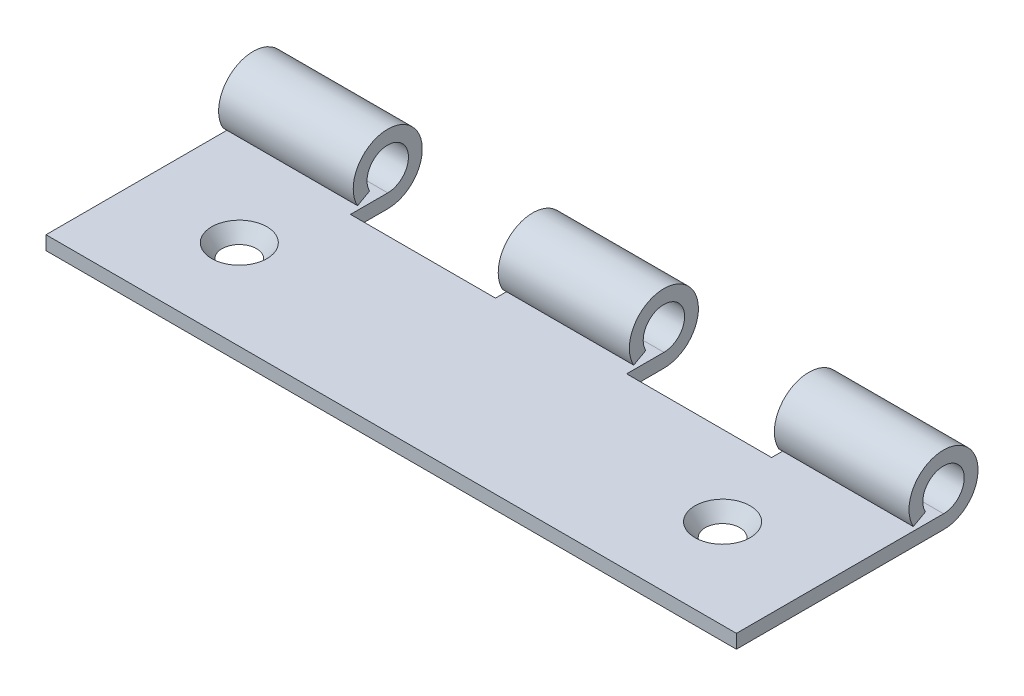
ISO-10303-21;
HEADER;
FILE_DESCRIPTION(('STEP AP214'),'2;1');
FILE_NAME('part.step','',(''),(''),'','','');
FILE_SCHEMA(('AUTOMOTIVE_DESIGN { 1 0 10303 214 1 1 1 1 }'));
ENDSEC;
DATA;
#1=APPLICATION_CONTEXT('core data for automotive mechanical design processes');
#2=APPLICATION_PROTOCOL_DEFINITION('international standard','automotive_design',2000,#1);
#3=PRODUCT_CONTEXT('',#1,'mechanical');
#4=PRODUCT('Part','Part','',(#3));
#5=PRODUCT_RELATED_PRODUCT_CATEGORY('part','',(#4));
#6=PRODUCT_DEFINITION_FORMATION('','',#4);
#7=PRODUCT_DEFINITION_CONTEXT('part definition',#1,'design');
#8=PRODUCT_DEFINITION('design','',#6,#7);
#9=PRODUCT_DEFINITION_SHAPE('','',#8);
#10=(LENGTH_UNIT() NAMED_UNIT(*) SI_UNIT(.MILLI.,.METRE.));
#11=(NAMED_UNIT(*) PLANE_ANGLE_UNIT() SI_UNIT($,.RADIAN.));
#12=(NAMED_UNIT(*) SI_UNIT($,.STERADIAN.) SOLID_ANGLE_UNIT());
#13=UNCERTAINTY_MEASURE_WITH_UNIT(LENGTH_MEASURE(1.E-05),#10,'distance_accuracy_value','');
#14=(GEOMETRIC_REPRESENTATION_CONTEXT(3) GLOBAL_UNCERTAINTY_ASSIGNED_CONTEXT((#13)) GLOBAL_UNIT_ASSIGNED_CONTEXT((#10,
#11,#12)) REPRESENTATION_CONTEXT('',''));
#15=CARTESIAN_POINT('',(0.,0.,0.));
#16=DIRECTION('',(0.,0.,1.));
#17=DIRECTION('',(1.,0.,0.));
#18=AXIS2_PLACEMENT_3D('',#15,#16,#17);
#19=CARTESIAN_POINT('',(0.,0.,0.));
#20=DIRECTION('',(1.,0.,0.));
#21=DIRECTION('',(0.,0.,-1.));
#22=AXIS2_PLACEMENT_3D('',#19,#20,#21);
#23=CYLINDRICAL_SURFACE('',#22,2.5);
#24=CARTESIAN_POINT('',(40.25,0.,0.));
#25=DIRECTION('',(1.,0.,0.));
#26=DIRECTION('',(0.,0.,-1.));
#27=AXIS2_PLACEMENT_3D('',#24,#25,#26);
#28=CIRCLE('',#27,2.5);
#29=CARTESIAN_POINT('',(40.25,-2.5,0.));
#30=VERTEX_POINT('',#29);
#31=CARTESIAN_POINT('',(40.25,-1.21202405061584,2.18654926784849));
#32=VERTEX_POINT('',#31);
#33=EDGE_CURVE('E193',#30,#32,#28,.T.);
#34=ORIENTED_EDGE('',*,*,#33,.T.);
#35=DIRECTION('',(1.,0.,0.));
#36=VECTOR('',#35,1.);
#37=CARTESIAN_POINT('',(0.,-1.21202405061584,2.18654926784849));
#38=LINE('',#37,#36);
#39=CARTESIAN_POINT('',(50.,-1.21202405061584,2.18654926784849));
#40=VERTEX_POINT('',#39);
#41=EDGE_CURVE('E287',#32,#40,#38,.T.);
#42=ORIENTED_EDGE('',*,*,#41,.T.);
#43=CARTESIAN_POINT('',(50.,0.,0.));
#44=DIRECTION('',(-1.,0.,0.));
#45=DIRECTION('',(0.,0.,1.));
#46=AXIS2_PLACEMENT_3D('',#43,#44,#45);
#47=CIRCLE('',#46,2.5);
#48=CARTESIAN_POINT('',(50.,-2.5,0.));
#49=VERTEX_POINT('',#48);
#50=EDGE_CURVE('E244',#40,#49,#47,.T.);
#51=ORIENTED_EDGE('',*,*,#50,.T.);
#52=DIRECTION('',(1.,0.,0.));
#53=VECTOR('',#52,1.);
#54=CARTESIAN_POINT('',(0.,-2.5,0.));
#55=LINE('',#54,#53);
#56=EDGE_CURVE('E314',#30,#49,#55,.T.);
#57=ORIENTED_EDGE('',*,*,#56,.F.);
#58=EDGE_LOOP('',(#34,#42,#51,#57));
#59=FACE_BOUND('',#58,.T.);
#60=ADVANCED_FACE('F15',(#59),#23,.T.);
#61=CARTESIAN_POINT('',(0.,0.,0.));
#62=DIRECTION('',(1.,0.,0.));
#63=DIRECTION('',(0.,0.,-1.));
#64=AXIS2_PLACEMENT_3D('',#61,#62,#63);
#65=CYLINDRICAL_SURFACE('',#64,1.5);
#66=CARTESIAN_POINT('',(40.25,0.,0.));
#67=DIRECTION('',(1.,0.,0.));
#68=DIRECTION('',(0.,0.,-1.));
#69=AXIS2_PLACEMENT_3D('',#66,#67,#68);
#70=CIRCLE('',#69,1.5);
#71=CARTESIAN_POINT('',(40.25,-1.5,0.));
#72=VERTEX_POINT('',#71);
#73=CARTESIAN_POINT('',(40.25,-0.727214430369506,1.31192956070909));
#74=VERTEX_POINT('',#73);
#75=EDGE_CURVE('E186',#72,#74,#70,.T.);
#76=ORIENTED_EDGE('',*,*,#75,.F.);
#77=DIRECTION('',(1.,0.,0.));
#78=VECTOR('',#77,1.);
#79=CARTESIAN_POINT('',(0.,-1.5,0.));
#80=LINE('',#79,#78);
#81=CARTESIAN_POINT('',(50.,-1.5,0.));
#82=VERTEX_POINT('',#81);
#83=EDGE_CURVE('E301',#72,#82,#80,.T.);
#84=ORIENTED_EDGE('',*,*,#83,.T.);
#85=CARTESIAN_POINT('',(50.,0.,0.));
#86=DIRECTION('',(-1.,0.,0.));
#87=DIRECTION('',(0.,0.,1.));
#88=AXIS2_PLACEMENT_3D('',#85,#86,#87);
#89=CIRCLE('',#88,1.5);
#90=CARTESIAN_POINT('',(50.,-0.727214430369506,1.31192956070909));
#91=VERTEX_POINT('',#90);
#92=EDGE_CURVE('E257',#91,#82,#89,.T.);
#93=ORIENTED_EDGE('',*,*,#92,.F.);
#94=DIRECTION('',(1.,0.,0.));
#95=VECTOR('',#94,1.);
#96=CARTESIAN_POINT('',(0.,-0.727214430369506,1.31192956070909));
#97=LINE('',#96,#95);
#98=EDGE_CURVE('E295',#74,#91,#97,.T.);
#99=ORIENTED_EDGE('',*,*,#98,.F.);
#100=EDGE_LOOP('',(#76,#84,#93,#99));
#101=FACE_BOUND('',#100,.T.);
#102=ADVANCED_FACE('F389',(#101),#65,.F.);
#103=CARTESIAN_POINT('',(0.,-0.727214430369506,1.31192956070909));
#104=DIRECTION('',(0.,0.874619707139396,0.484809620246337));
#105=DIRECTION('',(0.,0.484809620246337,-0.874619707139396));
#106=AXIS2_PLACEMENT_3D('',#103,#104,#105);
#107=PLANE('',#106);
#108=ORIENTED_EDGE('',*,*,#41,.F.);
#109=DIRECTION('',(0.,0.484809620246337,-0.874619707139396));
#110=VECTOR('',#109,1.);
#111=CARTESIAN_POINT('',(40.25,-0.727214430369503,1.31192956070909));
#112=LINE('',#111,#110);
#113=EDGE_CURVE('E189',#32,#74,#112,.T.);
#114=ORIENTED_EDGE('',*,*,#113,.T.);
#115=ORIENTED_EDGE('',*,*,#98,.T.);
#116=DIRECTION('',(0.,-0.484809620246337,0.874619707139396));
#117=VECTOR('',#116,1.);
#118=CARTESIAN_POINT('',(50.,-0.727214430369506,1.31192956070909));
#119=LINE('',#118,#117);
#120=EDGE_CURVE('E261',#91,#40,#119,.T.);
#121=ORIENTED_EDGE('',*,*,#120,.T.);
#122=EDGE_LOOP('',(#108,#114,#115,#121));
#123=FACE_BOUND('',#122,.T.);
#124=ADVANCED_FACE('F412',(#123),#107,.F.);
#125=CARTESIAN_POINT('',(20.25,-1.21202405061584,2.18654926784849));
#126=VERTEX_POINT('',#125);
#127=CARTESIAN_POINT('',(29.75,-1.21202405061584,2.18654926784849));
#128=VERTEX_POINT('',#127);
#129=EDGE_CURVE('E296',#126,#128,#38,.T.);
#130=ORIENTED_EDGE('',*,*,#129,.T.);
#131=CARTESIAN_POINT('',(29.75,0.,0.));
#132=DIRECTION('',(-1.,0.,0.));
#133=DIRECTION('',(0.,0.,1.));
#134=AXIS2_PLACEMENT_3D('',#131,#132,#133);
#135=CIRCLE('',#134,2.5);
#136=CARTESIAN_POINT('',(29.75,-2.5,0.));
#137=VERTEX_POINT('',#136);
#138=EDGE_CURVE('E183',#128,#137,#135,.T.);
#139=ORIENTED_EDGE('',*,*,#138,.T.);
#140=CARTESIAN_POINT('',(20.25,-2.5,0.));
#141=VERTEX_POINT('',#140);
#142=EDGE_CURVE('E164',#141,#137,#55,.T.);
#143=ORIENTED_EDGE('',*,*,#142,.F.);
#144=CARTESIAN_POINT('',(20.25,0.,0.));
#145=DIRECTION('',(1.,0.,0.));
#146=DIRECTION('',(0.,0.,-1.));
#147=AXIS2_PLACEMENT_3D('',#144,#145,#146);
#148=CIRCLE('',#147,2.5);
#149=EDGE_CURVE('E224',#141,#126,#148,.T.);
#150=ORIENTED_EDGE('',*,*,#149,.T.);
#151=EDGE_LOOP('',(#130,#139,#143,#150));
#152=FACE_BOUND('',#151,.T.);
#153=ADVANCED_FACE('F401',(#152),#23,.T.);
#154=CARTESIAN_POINT('',(29.75,0.,0.));
#155=DIRECTION('',(-1.,0.,0.));
#156=DIRECTION('',(0.,0.,1.));
#157=AXIS2_PLACEMENT_3D('',#154,#155,#156);
#158=CIRCLE('',#157,1.5);
#159=CARTESIAN_POINT('',(29.75,-0.727214430369505,1.31192956070909));
#160=VERTEX_POINT('',#159);
#161=CARTESIAN_POINT('',(29.75,-1.5,0.));
#162=VERTEX_POINT('',#161);
#163=EDGE_CURVE('E31',#160,#162,#158,.T.);
#164=ORIENTED_EDGE('',*,*,#163,.F.);
#165=CARTESIAN_POINT('',(20.25,-0.727214430369504,1.31192956070909));
#166=VERTEX_POINT('',#165);
#167=EDGE_CURVE('E302',#166,#160,#97,.T.);
#168=ORIENTED_EDGE('',*,*,#167,.F.);
#169=CARTESIAN_POINT('',(20.25,0.,0.));
#170=DIRECTION('',(1.,0.,0.));
#171=DIRECTION('',(0.,0.,-1.));
#172=AXIS2_PLACEMENT_3D('',#169,#170,#171);
#173=CIRCLE('',#172,1.5);
#174=CARTESIAN_POINT('',(20.25,-1.5,0.));
#175=VERTEX_POINT('',#174);
#176=EDGE_CURVE('E220',#175,#166,#173,.T.);
#177=ORIENTED_EDGE('',*,*,#176,.F.);
#178=EDGE_CURVE('E308',#175,#162,#80,.T.);
#179=ORIENTED_EDGE('',*,*,#178,.T.);
#180=EDGE_LOOP('',(#164,#168,#177,#179));
#181=FACE_BOUND('',#180,.T.);
#182=ADVANCED_FACE('F352',(#181),#65,.F.);
#183=ORIENTED_EDGE('',*,*,#167,.T.);
#184=DIRECTION('',(0.,-0.484809620246337,0.874619707139396));
#185=VECTOR('',#184,1.);
#186=CARTESIAN_POINT('',(29.75,-0.727214430369504,1.31192956070909));
#187=LINE('',#186,#185);
#188=EDGE_CURVE('E179',#160,#128,#187,.T.);
#189=ORIENTED_EDGE('',*,*,#188,.T.);
#190=ORIENTED_EDGE('',*,*,#129,.F.);
#191=DIRECTION('',(0.,0.484809620246337,-0.874619707139396));
#192=VECTOR('',#191,1.);
#193=CARTESIAN_POINT('',(20.25,-0.727214430369504,1.31192956070909));
#194=LINE('',#193,#192);
#195=EDGE_CURVE('E322',#126,#166,#194,.T.);
#196=ORIENTED_EDGE('',*,*,#195,.T.);
#197=EDGE_LOOP('',(#183,#189,#190,#196));
#198=FACE_BOUND('',#197,.T.);
#199=ADVANCED_FACE('F397',(#198),#107,.F.);
#200=CARTESIAN_POINT('',(0.,-2.5,0.));
#201=DIRECTION('',(0.,1.,0.));
#202=DIRECTION('',(-1.,0.,0.));
#203=AXIS2_PLACEMENT_3D('',#200,#201,#202);
#204=PLANE('',#203);
#205=CARTESIAN_POINT('',(42.5,-2.5,8.5));
#206=DIRECTION('',(0.,-1.,0.));
#207=DIRECTION('',(-1.,0.,0.));
#208=AXIS2_PLACEMENT_3D('',#205,#206,#207);
#209=CIRCLE('',#208,1.25);
#210=CARTESIAN_POINT('',(41.25,-2.5,8.5));
#211=VERTEX_POINT('',#210);
#212=EDGE_CURVE('E236',#211,#211,#209,.T.);
#213=ORIENTED_EDGE('',*,*,#212,.F.);
#214=EDGE_LOOP('',(#213));
#215=FACE_BOUND('',#214,.T.);
#216=DIRECTION('',(1.,0.,0.));
#217=VECTOR('',#216,1.);
#218=CARTESIAN_POINT('',(29.75,-2.5,2.7));
#219=LINE('',#218,#217);
#220=CARTESIAN_POINT('',(29.75,-2.5,2.7));
#221=VERTEX_POINT('',#220);
#222=CARTESIAN_POINT('',(40.25,-2.5,2.7));
#223=VERTEX_POINT('',#222);
#224=EDGE_CURVE('E149',#221,#223,#219,.T.);
#225=ORIENTED_EDGE('',*,*,#224,.T.);
#226=DIRECTION('',(0.,0.,1.));
#227=VECTOR('',#226,1.);
#228=CARTESIAN_POINT('',(40.25,-2.5,0.1));
#229=LINE('',#228,#227);
#230=EDGE_CURVE('E174',#30,#223,#229,.T.);
#231=ORIENTED_EDGE('',*,*,#230,.F.);
#232=ORIENTED_EDGE('',*,*,#56,.T.);
#233=DIRECTION('',(0.,0.,1.));
#234=VECTOR('',#233,1.);
#235=CARTESIAN_POINT('',(50.,-2.5,0.));
#236=LINE('',#235,#234);
#237=CARTESIAN_POINT('',(50.,-2.5,15.));
#238=VERTEX_POINT('',#237);
#239=EDGE_CURVE('E245',#49,#238,#236,.T.);
#240=ORIENTED_EDGE('',*,*,#239,.T.);
#241=DIRECTION('',(1.,0.,0.));
#242=VECTOR('',#241,1.);
#243=CARTESIAN_POINT('',(0.,-2.5,15.));
#244=LINE('',#243,#242);
#245=CARTESIAN_POINT('',(0.,-2.5,15.));
#246=VERTEX_POINT('',#245);
#247=EDGE_CURVE('E311',#246,#238,#244,.T.);
#248=ORIENTED_EDGE('',*,*,#247,.F.);
#249=DIRECTION('',(0.,0.,1.));
#250=VECTOR('',#249,1.);
#251=CARTESIAN_POINT('',(0.,-2.5,0.));
#252=LINE('',#251,#250);
#253=CARTESIAN_POINT('',(0.,-2.5,0.));
#254=VERTEX_POINT('',#253);
#255=EDGE_CURVE('E269',#254,#246,#252,.T.);
#256=ORIENTED_EDGE('',*,*,#255,.F.);
#257=CARTESIAN_POINT('',(9.75,-2.5,0.));
#258=VERTEX_POINT('',#257);
#259=EDGE_CURVE('E315',#254,#258,#55,.T.);
#260=ORIENTED_EDGE('',*,*,#259,.T.);
#261=DIRECTION('',(0.,0.,-1.));
#262=VECTOR('',#261,1.);
#263=CARTESIAN_POINT('',(9.75,-2.5,0.1));
#264=LINE('',#263,#262);
#265=CARTESIAN_POINT('',(9.75,-2.5,2.7));
#266=VERTEX_POINT('',#265);
#267=EDGE_CURVE('E196',#266,#258,#264,.T.);
#268=ORIENTED_EDGE('',*,*,#267,.F.);
#269=DIRECTION('',(1.,0.,0.));
#270=VECTOR('',#269,1.);
#271=CARTESIAN_POINT('',(9.75,-2.5,2.7));
#272=LINE('',#271,#270);
#273=CARTESIAN_POINT('',(20.25,-2.5,2.7));
#274=VERTEX_POINT('',#273);
#275=EDGE_CURVE('E202',#266,#274,#272,.T.);
#276=ORIENTED_EDGE('',*,*,#275,.T.);
#277=DIRECTION('',(0.,0.,1.));
#278=VECTOR('',#277,1.);
#279=CARTESIAN_POINT('',(20.25,-2.5,0.1));
#280=LINE('',#279,#278);
#281=EDGE_CURVE('E210',#141,#274,#280,.T.);
#282=ORIENTED_EDGE('',*,*,#281,.F.);
#283=ORIENTED_EDGE('',*,*,#142,.T.);
#284=DIRECTION('',(0.,0.,-1.));
#285=VECTOR('',#284,1.);
#286=CARTESIAN_POINT('',(29.75,-2.5,0.1));
#287=LINE('',#286,#285);
#288=EDGE_CURVE('E143',#221,#137,#287,.T.);
#289=ORIENTED_EDGE('',*,*,#288,.F.);
#290=EDGE_LOOP('',(#225,#231,#232,#240,#248,#256,#260,#268,#276,#282,#283,#289));
#291=FACE_BOUND('',#290,.T.);
#292=CARTESIAN_POINT('',(7.5,-2.5,8.5));
#293=DIRECTION('',(0.,-1.,0.));
#294=DIRECTION('',(-1.,0.,0.));
#295=AXIS2_PLACEMENT_3D('',#292,#293,#294);
#296=CIRCLE('',#295,1.25);
#297=CARTESIAN_POINT('',(6.25,-2.5,8.5));
#298=VERTEX_POINT('',#297);
#299=EDGE_CURVE('E227',#298,#298,#296,.T.);
#300=ORIENTED_EDGE('',*,*,#299,.F.);
#301=EDGE_LOOP('',(#300));
#302=FACE_BOUND('',#301,.T.);
#303=ADVANCED_FACE('F160',(#215,#291,#302),#204,.F.);
#304=CARTESIAN_POINT('',(0.,-1.5,0.));
#305=DIRECTION('',(0.,1.,0.));
#306=DIRECTION('',(-1.,0.,0.));
#307=AXIS2_PLACEMENT_3D('',#304,#305,#306);
#308=PLANE('',#307);
#309=DIRECTION('',(0.,0.,-1.));
#310=VECTOR('',#309,1.);
#311=CARTESIAN_POINT('',(40.25,-1.5,0.));
#312=LINE('',#311,#310);
#313=CARTESIAN_POINT('',(40.25,-1.5,2.7));
#314=VERTEX_POINT('',#313);
#315=EDGE_CURVE('E10',#314,#72,#312,.T.);
#316=ORIENTED_EDGE('',*,*,#315,.F.);
#317=DIRECTION('',(1.,0.,0.));
#318=VECTOR('',#317,1.);
#319=CARTESIAN_POINT('',(0.,-1.5,2.7));
#320=LINE('',#319,#318);
#321=CARTESIAN_POINT('',(29.75,-1.5,2.7));
#322=VERTEX_POINT('',#321);
#323=EDGE_CURVE('E24',#322,#314,#320,.T.);
#324=ORIENTED_EDGE('',*,*,#323,.F.);
#325=DIRECTION('',(0.,0.,1.));
#326=VECTOR('',#325,1.);
#327=CARTESIAN_POINT('',(29.75,-1.5,0.));
#328=LINE('',#327,#326);
#329=EDGE_CURVE('E145',#162,#322,#328,.T.);
#330=ORIENTED_EDGE('',*,*,#329,.F.);
#331=ORIENTED_EDGE('',*,*,#178,.F.);
#332=DIRECTION('',(0.,0.,-1.));
#333=VECTOR('',#332,1.);
#334=CARTESIAN_POINT('',(20.25,-1.5,0.));
#335=LINE('',#334,#333);
#336=CARTESIAN_POINT('',(20.25,-1.5,2.7));
#337=VERTEX_POINT('',#336);
#338=EDGE_CURVE('E223',#337,#175,#335,.T.);
#339=ORIENTED_EDGE('',*,*,#338,.F.);
#340=DIRECTION('',(1.,0.,0.));
#341=VECTOR('',#340,1.);
#342=CARTESIAN_POINT('',(0.,-1.5,2.7));
#343=LINE('',#342,#341);
#344=CARTESIAN_POINT('',(9.75,-1.5,2.7));
#345=VERTEX_POINT('',#344);
#346=EDGE_CURVE('E326',#345,#337,#343,.T.);
#347=ORIENTED_EDGE('',*,*,#346,.F.);
#348=DIRECTION('',(0.,0.,1.));
#349=VECTOR('',#348,1.);
#350=CARTESIAN_POINT('',(9.75,-1.5,0.));
#351=LINE('',#350,#349);
#352=CARTESIAN_POINT('',(9.75,-1.5,0.));
#353=VERTEX_POINT('',#352);
#354=EDGE_CURVE('E217',#353,#345,#351,.T.);
#355=ORIENTED_EDGE('',*,*,#354,.F.);
#356=CARTESIAN_POINT('',(0.,-1.5,0.));
#357=VERTEX_POINT('',#356);
#358=EDGE_CURVE('E303',#357,#353,#80,.T.);
#359=ORIENTED_EDGE('',*,*,#358,.F.);
#360=DIRECTION('',(0.,0.,1.));
#361=VECTOR('',#360,1.);
#362=CARTESIAN_POINT('',(0.,-1.5,0.));
#363=LINE('',#362,#361);
#364=CARTESIAN_POINT('',(0.,-1.5,15.));
#365=VERTEX_POINT('',#364);
#366=EDGE_CURVE('E276',#357,#365,#363,.T.);
#367=ORIENTED_EDGE('',*,*,#366,.T.);
#368=DIRECTION('',(1.,0.,0.));
#369=VECTOR('',#368,1.);
#370=CARTESIAN_POINT('',(0.,-1.5,15.));
#371=LINE('',#370,#369);
#372=CARTESIAN_POINT('',(50.,-1.5,15.));
#373=VERTEX_POINT('',#372);
#374=EDGE_CURVE('E307',#365,#373,#371,.T.);
#375=ORIENTED_EDGE('',*,*,#374,.T.);
#376=DIRECTION('',(0.,0.,1.));
#377=VECTOR('',#376,1.);
#378=CARTESIAN_POINT('',(50.,-1.5,0.));
#379=LINE('',#378,#377);
#380=EDGE_CURVE('E253',#82,#373,#379,.T.);
#381=ORIENTED_EDGE('',*,*,#380,.F.);
#382=ORIENTED_EDGE('',*,*,#83,.F.);
#383=EDGE_LOOP('',(#316,#324,#330,#331,#339,#347,#355,#359,#367,#375,#381,#382));
#384=FACE_BOUND('',#383,.T.);
#385=CARTESIAN_POINT('',(42.5,-1.5,8.5));
#386=DIRECTION('',(0.,-1.,0.));
#387=DIRECTION('',(-1.,0.,0.));
#388=AXIS2_PLACEMENT_3D('',#385,#386,#387);
#389=CIRCLE('',#388,2.);
#390=CARTESIAN_POINT('',(40.5,-1.5,8.5));
#391=VERTEX_POINT('',#390);
#392=EDGE_CURVE('E240',#391,#391,#389,.T.);
#393=ORIENTED_EDGE('',*,*,#392,.T.);
#394=EDGE_LOOP('',(#393));
#395=FACE_BOUND('',#394,.T.);
#396=CARTESIAN_POINT('',(7.5,-1.5,8.5));
#397=DIRECTION('',(0.,-1.,0.));
#398=DIRECTION('',(-1.,0.,0.));
#399=AXIS2_PLACEMENT_3D('',#396,#397,#398);
#400=CIRCLE('',#399,2.);
#401=CARTESIAN_POINT('',(5.5,-1.5,8.5));
#402=VERTEX_POINT('',#401);
#403=EDGE_CURVE('E232',#402,#402,#400,.T.);
#404=ORIENTED_EDGE('',*,*,#403,.T.);
#405=EDGE_LOOP('',(#404));
#406=FACE_BOUND('',#405,.T.);
#407=ADVANCED_FACE('F338',(#384,#395,#406),#308,.T.);
#408=CARTESIAN_POINT('',(0.,-1.21202405061584,2.18654926784849));
#409=VERTEX_POINT('',#408);
#410=CARTESIAN_POINT('',(9.75,-1.21202405061584,2.18654926784849));
#411=VERTEX_POINT('',#410);
#412=EDGE_CURVE('E291',#409,#411,#38,.T.);
#413=ORIENTED_EDGE('',*,*,#412,.T.);
#414=CARTESIAN_POINT('',(9.75,0.,0.));
#415=DIRECTION('',(-1.,0.,0.));
#416=DIRECTION('',(0.,0.,1.));
#417=AXIS2_PLACEMENT_3D('',#414,#415,#416);
#418=CIRCLE('',#417,2.5);
#419=EDGE_CURVE('E39',#411,#258,#418,.T.);
#420=ORIENTED_EDGE('',*,*,#419,.T.);
#421=ORIENTED_EDGE('',*,*,#259,.F.);
#422=CARTESIAN_POINT('',(0.,0.,0.));
#423=DIRECTION('',(-1.,0.,0.));
#424=DIRECTION('',(0.,0.,1.));
#425=AXIS2_PLACEMENT_3D('',#422,#423,#424);
#426=CIRCLE('',#425,2.5);
#427=EDGE_CURVE('E265',#409,#254,#426,.T.);
#428=ORIENTED_EDGE('',*,*,#427,.F.);
#429=EDGE_LOOP('',(#413,#420,#421,#428));
#430=FACE_BOUND('',#429,.T.);
#431=ADVANCED_FACE('F17',(#430),#23,.T.);
#432=CARTESIAN_POINT('',(0.,-1.5,15.));
#433=DIRECTION('',(0.,0.,1.));
#434=DIRECTION('',(1.,0.,0.));
#435=AXIS2_PLACEMENT_3D('',#432,#433,#434);
#436=PLANE('',#435);
#437=DIRECTION('',(0.,-1.,0.));
#438=VECTOR('',#437,1.);
#439=CARTESIAN_POINT('',(50.,-1.5,15.));
#440=LINE('',#439,#438);
#441=EDGE_CURVE('E249',#373,#238,#440,.T.);
#442=ORIENTED_EDGE('',*,*,#441,.F.);
#443=ORIENTED_EDGE('',*,*,#374,.F.);
#444=DIRECTION('',(0.,-1.,0.));
#445=VECTOR('',#444,1.);
#446=CARTESIAN_POINT('',(0.,-1.5,15.));
#447=LINE('',#446,#445);
#448=EDGE_CURVE('E272',#365,#246,#447,.T.);
#449=ORIENTED_EDGE('',*,*,#448,.T.);
#450=ORIENTED_EDGE('',*,*,#247,.T.);
#451=EDGE_LOOP('',(#442,#443,#449,#450));
#452=FACE_BOUND('',#451,.T.);
#453=ADVANCED_FACE('F381',(#452),#436,.T.);
#454=CARTESIAN_POINT('',(9.75,0.,0.));
#455=DIRECTION('',(-1.,0.,0.));
#456=DIRECTION('',(0.,0.,1.));
#457=AXIS2_PLACEMENT_3D('',#454,#455,#456);
#458=CIRCLE('',#457,1.5);
#459=CARTESIAN_POINT('',(9.75,-0.727214430369505,1.31192956070909));
#460=VERTEX_POINT('',#459);
#461=EDGE_CURVE('E212',#460,#353,#458,.T.);
#462=ORIENTED_EDGE('',*,*,#461,.F.);
#463=CARTESIAN_POINT('',(0.,-0.727214430369506,1.31192956070909));
#464=VERTEX_POINT('',#463);
#465=EDGE_CURVE('E297',#464,#460,#97,.T.);
#466=ORIENTED_EDGE('',*,*,#465,.F.);
#467=CARTESIAN_POINT('',(0.,0.,0.));
#468=DIRECTION('',(-1.,0.,0.));
#469=DIRECTION('',(0.,0.,1.));
#470=AXIS2_PLACEMENT_3D('',#467,#468,#469);
#471=CIRCLE('',#470,1.5);
#472=EDGE_CURVE('E280',#464,#357,#471,.T.);
#473=ORIENTED_EDGE('',*,*,#472,.T.);
#474=ORIENTED_EDGE('',*,*,#358,.T.);
#475=EDGE_LOOP('',(#462,#466,#473,#474));
#476=FACE_BOUND('',#475,.T.);
#477=ADVANCED_FACE('F372',(#476),#65,.F.);
#478=ORIENTED_EDGE('',*,*,#465,.T.);
#479=DIRECTION('',(0.,-0.484809620246337,0.874619707139396));
#480=VECTOR('',#479,1.);
#481=CARTESIAN_POINT('',(9.75,-0.727214430369505,1.31192956070909));
#482=LINE('',#481,#480);
#483=EDGE_CURVE('E319',#460,#411,#482,.T.);
#484=ORIENTED_EDGE('',*,*,#483,.T.);
#485=ORIENTED_EDGE('',*,*,#412,.F.);
#486=DIRECTION('',(0.,-0.484809620246337,0.874619707139396));
#487=VECTOR('',#486,1.);
#488=CARTESIAN_POINT('',(0.,-0.727214430369506,1.31192956070909));
#489=LINE('',#488,#487);
#490=EDGE_CURVE('E284',#464,#409,#489,.T.);
#491=ORIENTED_EDGE('',*,*,#490,.F.);
#492=EDGE_LOOP('',(#478,#484,#485,#491));
#493=FACE_BOUND('',#492,.T.);
#494=ADVANCED_FACE('F415',(#493),#107,.F.);
#495=CARTESIAN_POINT('',(0.,0.,0.));
#496=DIRECTION('',(-1.,0.,0.));
#497=DIRECTION('',(0.,0.,1.));
#498=AXIS2_PLACEMENT_3D('',#495,#496,#497);
#499=PLANE('',#498);
#500=ORIENTED_EDGE('',*,*,#427,.T.);
#501=ORIENTED_EDGE('',*,*,#255,.T.);
#502=ORIENTED_EDGE('',*,*,#448,.F.);
#503=ORIENTED_EDGE('',*,*,#366,.F.);
#504=ORIENTED_EDGE('',*,*,#472,.F.);
#505=ORIENTED_EDGE('',*,*,#490,.T.);
#506=EDGE_LOOP('',(#500,#501,#502,#503,#504,#505));
#507=FACE_BOUND('',#506,.T.);
#508=ADVANCED_FACE('F376',(#507),#499,.T.);
#509=CARTESIAN_POINT('',(50.,0.,0.));
#510=DIRECTION('',(-1.,0.,0.));
#511=DIRECTION('',(0.,0.,1.));
#512=AXIS2_PLACEMENT_3D('',#509,#510,#511);
#513=PLANE('',#512);
#514=ORIENTED_EDGE('',*,*,#50,.F.);
#515=ORIENTED_EDGE('',*,*,#120,.F.);
#516=ORIENTED_EDGE('',*,*,#92,.T.);
#517=ORIENTED_EDGE('',*,*,#380,.T.);
#518=ORIENTED_EDGE('',*,*,#441,.T.);
#519=ORIENTED_EDGE('',*,*,#239,.F.);
#520=EDGE_LOOP('',(#514,#515,#516,#517,#518,#519));
#521=FACE_BOUND('',#520,.T.);
#522=ADVANCED_FACE('F386',(#521),#513,.F.);
#523=CARTESIAN_POINT('',(42.5,-1.5,8.5));
#524=DIRECTION('',(0.,1.,0.));
#525=DIRECTION('',(1.,0.,0.));
#526=AXIS2_PLACEMENT_3D('',#523,#524,#525);
#527=CONICAL_SURFACE('',#526,2.,0.643501108793284);
#528=ORIENTED_EDGE('',*,*,#212,.T.);
#529=EDGE_LOOP('',(#528));
#530=FACE_BOUND('',#529,.T.);
#531=ORIENTED_EDGE('',*,*,#392,.F.);
#532=EDGE_LOOP('',(#531));
#533=FACE_BOUND('',#532,.T.);
#534=ADVANCED_FACE('F505',(#530,#533),#527,.F.);
#535=CARTESIAN_POINT('',(7.5,-1.5,8.5));
#536=DIRECTION('',(0.,1.,0.));
#537=DIRECTION('',(1.,0.,0.));
#538=AXIS2_PLACEMENT_3D('',#535,#536,#537);
#539=CONICAL_SURFACE('',#538,2.,0.643501108793284);
#540=ORIENTED_EDGE('',*,*,#299,.T.);
#541=EDGE_LOOP('',(#540));
#542=FACE_BOUND('',#541,.T.);
#543=ORIENTED_EDGE('',*,*,#403,.F.);
#544=EDGE_LOOP('',(#543));
#545=FACE_BOUND('',#544,.T.);
#546=ADVANCED_FACE('F514',(#542,#545),#539,.F.);
#547=CARTESIAN_POINT('',(20.25,0.,0.1));
#548=DIRECTION('',(1.,0.,0.));
#549=DIRECTION('',(0.,0.,-1.));
#550=AXIS2_PLACEMENT_3D('',#547,#548,#549);
#551=PLANE('',#550);
#552=ORIENTED_EDGE('',*,*,#281,.T.);
#553=DIRECTION('',(0.,1.,0.));
#554=VECTOR('',#553,1.);
#555=CARTESIAN_POINT('',(20.25,0.,2.7));
#556=LINE('',#555,#554);
#557=EDGE_CURVE('E206',#274,#337,#556,.T.);
#558=ORIENTED_EDGE('',*,*,#557,.T.);
#559=ORIENTED_EDGE('',*,*,#338,.T.);
#560=ORIENTED_EDGE('',*,*,#176,.T.);
#561=ORIENTED_EDGE('',*,*,#195,.F.);
#562=ORIENTED_EDGE('',*,*,#149,.F.);
#563=EDGE_LOOP('',(#552,#558,#559,#560,#561,#562));
#564=FACE_BOUND('',#563,.T.);
#565=ADVANCED_FACE('F359',(#564),#551,.F.);
#566=CARTESIAN_POINT('',(9.75,0.,0.1));
#567=DIRECTION('',(-1.,0.,0.));
#568=DIRECTION('',(0.,0.,1.));
#569=AXIS2_PLACEMENT_3D('',#566,#567,#568);
#570=PLANE('',#569);
#571=ORIENTED_EDGE('',*,*,#419,.F.);
#572=ORIENTED_EDGE('',*,*,#483,.F.);
#573=ORIENTED_EDGE('',*,*,#461,.T.);
#574=ORIENTED_EDGE('',*,*,#354,.T.);
#575=DIRECTION('',(0.,-1.,0.));
#576=VECTOR('',#575,1.);
#577=CARTESIAN_POINT('',(9.75,0.,2.7));
#578=LINE('',#577,#576);
#579=EDGE_CURVE('E199',#345,#266,#578,.T.);
#580=ORIENTED_EDGE('',*,*,#579,.T.);
#581=ORIENTED_EDGE('',*,*,#267,.T.);
#582=EDGE_LOOP('',(#571,#572,#573,#574,#580,#581));
#583=FACE_BOUND('',#582,.T.);
#584=ADVANCED_FACE('F368',(#583),#570,.F.);
#585=CARTESIAN_POINT('',(9.75,0.,2.7));
#586=DIRECTION('',(0.,0.,1.));
#587=DIRECTION('',(1.,0.,0.));
#588=AXIS2_PLACEMENT_3D('',#585,#586,#587);
#589=PLANE('',#588);
#590=ORIENTED_EDGE('',*,*,#346,.T.);
#591=ORIENTED_EDGE('',*,*,#557,.F.);
#592=ORIENTED_EDGE('',*,*,#275,.F.);
#593=ORIENTED_EDGE('',*,*,#579,.F.);
#594=EDGE_LOOP('',(#590,#591,#592,#593));
#595=FACE_BOUND('',#594,.T.);
#596=ADVANCED_FACE('F364',(#595),#589,.F.);
#597=CARTESIAN_POINT('',(40.25,0.,0.1));
#598=DIRECTION('',(1.,0.,0.));
#599=DIRECTION('',(0.,0.,-1.));
#600=AXIS2_PLACEMENT_3D('',#597,#598,#599);
#601=PLANE('',#600);
#602=ORIENTED_EDGE('',*,*,#230,.T.);
#603=DIRECTION('',(0.,1.,0.));
#604=VECTOR('',#603,1.);
#605=CARTESIAN_POINT('',(40.25,0.,2.7));
#606=LINE('',#605,#604);
#607=EDGE_CURVE('E155',#223,#314,#606,.T.);
#608=ORIENTED_EDGE('',*,*,#607,.T.);
#609=ORIENTED_EDGE('',*,*,#315,.T.);
#610=ORIENTED_EDGE('',*,*,#75,.T.);
#611=ORIENTED_EDGE('',*,*,#113,.F.);
#612=ORIENTED_EDGE('',*,*,#33,.F.);
#613=EDGE_LOOP('',(#602,#608,#609,#610,#611,#612));
#614=FACE_BOUND('',#613,.T.);
#615=ADVANCED_FACE('F335',(#614),#601,.F.);
#616=CARTESIAN_POINT('',(29.75,0.,0.1));
#617=DIRECTION('',(-1.,0.,0.));
#618=DIRECTION('',(0.,0.,1.));
#619=AXIS2_PLACEMENT_3D('',#616,#617,#618);
#620=PLANE('',#619);
#621=ORIENTED_EDGE('',*,*,#138,.F.);
#622=ORIENTED_EDGE('',*,*,#188,.F.);
#623=ORIENTED_EDGE('',*,*,#163,.T.);
#624=ORIENTED_EDGE('',*,*,#329,.T.);
#625=DIRECTION('',(0.,-1.,0.));
#626=VECTOR('',#625,1.);
#627=CARTESIAN_POINT('',(29.75,0.,2.7));
#628=LINE('',#627,#626);
#629=EDGE_CURVE('E139',#322,#221,#628,.T.);
#630=ORIENTED_EDGE('',*,*,#629,.T.);
#631=ORIENTED_EDGE('',*,*,#288,.T.);
#632=EDGE_LOOP('',(#621,#622,#623,#624,#630,#631));
#633=FACE_BOUND('',#632,.T.);
#634=ADVANCED_FACE('F141',(#633),#620,.F.);
#635=CARTESIAN_POINT('',(29.75,0.,2.7));
#636=DIRECTION('',(0.,0.,1.));
#637=DIRECTION('',(1.,0.,0.));
#638=AXIS2_PLACEMENT_3D('',#635,#636,#637);
#639=PLANE('',#638);
#640=ORIENTED_EDGE('',*,*,#323,.T.);
#641=ORIENTED_EDGE('',*,*,#607,.F.);
#642=ORIENTED_EDGE('',*,*,#224,.F.);
#643=ORIENTED_EDGE('',*,*,#629,.F.);
#644=EDGE_LOOP('',(#640,#641,#642,#643));
#645=FACE_BOUND('',#644,.T.);
#646=ADVANCED_FACE('F153',(#645),#639,.F.);
#647=CLOSED_SHELL('',(#60,#102,#124,#153,#182,#199,#303,#407,#431,#453,#477,#494,#508,#522,#534,
#546,#565,#584,#596,#615,#634,#646));
#648=MANIFOLD_SOLID_BREP('B1',#647);
#649=ADVANCED_BREP_SHAPE_REPRESENTATION('',(#18,#648),#14);
#650=SHAPE_DEFINITION_REPRESENTATION(#9,#649);
ENDSEC;
END-ISO-10303-21;
